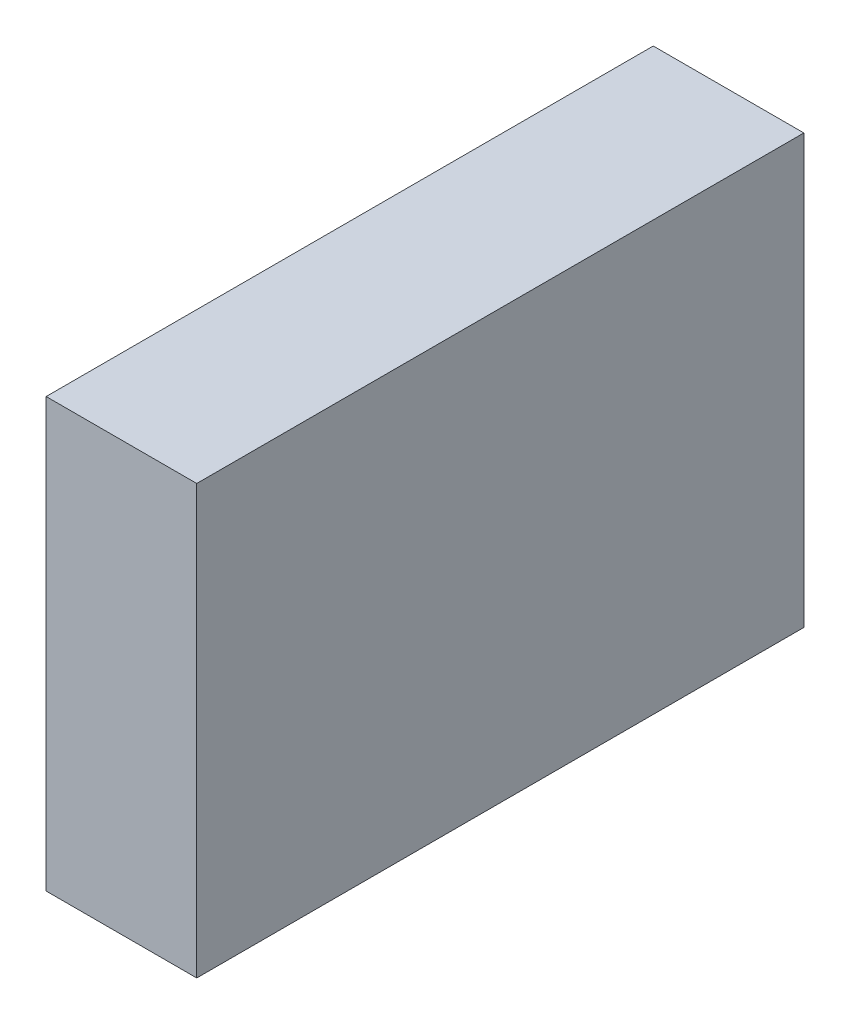
ISO-10303-21;
HEADER;
FILE_DESCRIPTION(('STEP AP214'),'2;1');
FILE_NAME('part.step','',(''),(''),'','','');
FILE_SCHEMA(('AUTOMOTIVE_DESIGN { 1 0 10303 214 1 1 1 1 }'));
ENDSEC;
DATA;
#1=APPLICATION_CONTEXT('core data for automotive mechanical design processes');
#2=APPLICATION_PROTOCOL_DEFINITION('international standard','automotive_design',2000,#1);
#3=PRODUCT_CONTEXT('',#1,'mechanical');
#4=PRODUCT('Part','Part','',(#3));
#5=PRODUCT_RELATED_PRODUCT_CATEGORY('part','',(#4));
#6=PRODUCT_DEFINITION_FORMATION('','',#4);
#7=PRODUCT_DEFINITION_CONTEXT('part definition',#1,'design');
#8=PRODUCT_DEFINITION('design','',#6,#7);
#9=PRODUCT_DEFINITION_SHAPE('','',#8);
#10=(LENGTH_UNIT() NAMED_UNIT(*) SI_UNIT(.MILLI.,.METRE.));
#11=(NAMED_UNIT(*) PLANE_ANGLE_UNIT() SI_UNIT($,.RADIAN.));
#12=(NAMED_UNIT(*) SI_UNIT($,.STERADIAN.) SOLID_ANGLE_UNIT());
#13=UNCERTAINTY_MEASURE_WITH_UNIT(LENGTH_MEASURE(1.E-05),#10,'distance_accuracy_value','');
#14=(GEOMETRIC_REPRESENTATION_CONTEXT(3) GLOBAL_UNCERTAINTY_ASSIGNED_CONTEXT((#13)) GLOBAL_UNIT_ASSIGNED_CONTEXT((#10,
#11,#12)) REPRESENTATION_CONTEXT('',''));
#15=CARTESIAN_POINT('',(0.,0.,0.));
#16=DIRECTION('',(0.,0.,1.));
#17=DIRECTION('',(1.,0.,0.));
#18=AXIS2_PLACEMENT_3D('',#15,#16,#17);
#19=CARTESIAN_POINT('',(-14.,41.5,-60.5));
#20=DIRECTION('',(0.,-1.,0.));
#21=DIRECTION('',(0.,0.,-1.));
#22=AXIS2_PLACEMENT_3D('',#19,#20,#21);
#23=PLANE('',#22);
#24=DIRECTION('',(1.,0.,0.));
#25=VECTOR('',#24,1.);
#26=CARTESIAN_POINT('',(-14.,41.5,-60.5));
#27=LINE('',#26,#25);
#28=CARTESIAN_POINT('',(-14.,41.5,-60.5));
#29=VERTEX_POINT('',#28);
#30=CARTESIAN_POINT('',(-10.16,41.5,-60.5));
#31=VERTEX_POINT('',#30);
#32=EDGE_CURVE('E182',#29,#31,#27,.T.);
#33=ORIENTED_EDGE('',*,*,#32,.T.);
#34=DIRECTION('',(0.,0.,-1.));
#35=VECTOR('',#34,1.);
#36=CARTESIAN_POINT('',(-10.16,41.5,-32.5));
#37=LINE('',#36,#35);
#38=CARTESIAN_POINT('',(-10.16,41.5,-32.5));
#39=VERTEX_POINT('',#38);
#40=EDGE_CURVE('E168',#39,#31,#37,.T.);
#41=ORIENTED_EDGE('',*,*,#40,.F.);
#42=DIRECTION('',(1.,0.,0.));
#43=VECTOR('',#42,1.);
#44=CARTESIAN_POINT('',(-14.,41.5,-32.5));
#45=LINE('',#44,#43);
#46=CARTESIAN_POINT('',(-14.,41.5,-32.5));
#47=VERTEX_POINT('',#46);
#48=EDGE_CURVE('E179',#47,#39,#45,.T.);
#49=ORIENTED_EDGE('',*,*,#48,.F.);
#50=DIRECTION('',(0.,0.,-1.));
#51=VECTOR('',#50,1.);
#52=CARTESIAN_POINT('',(-14.,41.5,-60.5));
#53=LINE('',#52,#51);
#54=EDGE_CURVE('E701',#47,#29,#53,.T.);
#55=ORIENTED_EDGE('',*,*,#54,.T.);
#56=EDGE_LOOP('',(#33,#41,#49,#55));
#57=FACE_BOUND('',#56,.T.);
#58=ADVANCED_FACE('F44',(#57),#23,.T.);
#59=CARTESIAN_POINT('',(-14.,41.5,-60.5));
#60=DIRECTION('',(0.,0.,1.));
#61=DIRECTION('',(1.,0.,0.));
#62=AXIS2_PLACEMENT_3D('',#59,#60,#61);
#63=PLANE('',#62);
#64=DIRECTION('',(1.,0.,0.));
#65=VECTOR('',#64,1.);
#66=CARTESIAN_POINT('',(-14.,0.,-60.5));
#67=LINE('',#66,#65);
#68=CARTESIAN_POINT('',(-14.,0.,-60.5));
#69=VERTEX_POINT('',#68);
#70=CARTESIAN_POINT('',(-10.16,0.,-60.5));
#71=VERTEX_POINT('',#70);
#72=EDGE_CURVE('E194',#69,#71,#67,.T.);
#73=ORIENTED_EDGE('',*,*,#72,.T.);
#74=DIRECTION('',(0.,-1.,0.));
#75=VECTOR('',#74,1.);
#76=CARTESIAN_POINT('',(-10.16,41.5,-60.5));
#77=LINE('',#76,#75);
#78=EDGE_CURVE('E184',#31,#71,#77,.T.);
#79=ORIENTED_EDGE('',*,*,#78,.F.);
#80=ORIENTED_EDGE('',*,*,#32,.F.);
#81=DIRECTION('',(0.,-1.,0.));
#82=VECTOR('',#81,1.);
#83=CARTESIAN_POINT('',(-14.,41.5,-60.5));
#84=LINE('',#83,#82);
#85=EDGE_CURVE('E704',#29,#69,#84,.T.);
#86=ORIENTED_EDGE('',*,*,#85,.T.);
#87=EDGE_LOOP('',(#73,#79,#80,#86));
#88=FACE_BOUND('',#87,.T.);
#89=ADVANCED_FACE('F293',(#88),#63,.T.);
#90=CARTESIAN_POINT('',(-14.,0.,-60.5));
#91=DIRECTION('',(0.,1.,0.));
#92=DIRECTION('',(0.,0.,1.));
#93=AXIS2_PLACEMENT_3D('',#90,#91,#92);
#94=PLANE('',#93);
#95=DIRECTION('',(1.,0.,0.));
#96=VECTOR('',#95,1.);
#97=CARTESIAN_POINT('',(-14.,0.,-32.5));
#98=LINE('',#97,#96);
#99=CARTESIAN_POINT('',(-14.,0.,-32.5));
#100=VERTEX_POINT('',#99);
#101=CARTESIAN_POINT('',(-10.16,0.,-32.5));
#102=VERTEX_POINT('',#101);
#103=EDGE_CURVE('E190',#100,#102,#98,.T.);
#104=ORIENTED_EDGE('',*,*,#103,.T.);
#105=DIRECTION('',(0.,0.,1.));
#106=VECTOR('',#105,1.);
#107=CARTESIAN_POINT('',(-10.16,0.,-32.5));
#108=LINE('',#107,#106);
#109=EDGE_CURVE('E60',#71,#102,#108,.T.);
#110=ORIENTED_EDGE('',*,*,#109,.F.);
#111=ORIENTED_EDGE('',*,*,#72,.F.);
#112=DIRECTION('',(0.,0.,1.));
#113=VECTOR('',#112,1.);
#114=CARTESIAN_POINT('',(-14.,0.,-60.5));
#115=LINE('',#114,#113);
#116=EDGE_CURVE('E196',#69,#100,#115,.T.);
#117=ORIENTED_EDGE('',*,*,#116,.T.);
#118=EDGE_LOOP('',(#104,#110,#111,#117));
#119=FACE_BOUND('',#118,.T.);
#120=ADVANCED_FACE('F299',(#119),#94,.T.);
#121=CARTESIAN_POINT('',(-14.,41.5,-32.5));
#122=DIRECTION('',(0.,0.,-1.));
#123=DIRECTION('',(0.,1.,0.));
#124=AXIS2_PLACEMENT_3D('',#121,#122,#123);
#125=PLANE('',#124);
#126=ORIENTED_EDGE('',*,*,#48,.T.);
#127=DIRECTION('',(0.,1.,0.));
#128=VECTOR('',#127,1.);
#129=CARTESIAN_POINT('',(-10.16,41.5,-32.5));
#130=LINE('',#129,#128);
#131=EDGE_CURVE('E165',#102,#39,#130,.T.);
#132=ORIENTED_EDGE('',*,*,#131,.F.);
#133=ORIENTED_EDGE('',*,*,#103,.F.);
#134=DIRECTION('',(0.,1.,0.));
#135=VECTOR('',#134,1.);
#136=CARTESIAN_POINT('',(-14.,41.5,-32.5));
#137=LINE('',#136,#135);
#138=EDGE_CURVE('E188',#100,#47,#137,.T.);
#139=ORIENTED_EDGE('',*,*,#138,.T.);
#140=EDGE_LOOP('',(#126,#132,#133,#139));
#141=FACE_BOUND('',#140,.T.);
#142=ADVANCED_FACE('F186',(#141),#125,.T.);
#143=CARTESIAN_POINT('',(-14.,0.,0.));
#144=DIRECTION('',(-1.,0.,0.));
#145=DIRECTION('',(0.,0.,1.));
#146=AXIS2_PLACEMENT_3D('',#143,#144,#145);
#147=PLANE('',#146);
#148=ORIENTED_EDGE('',*,*,#85,.F.);
#149=ORIENTED_EDGE('',*,*,#54,.F.);
#150=ORIENTED_EDGE('',*,*,#138,.F.);
#151=ORIENTED_EDGE('',*,*,#116,.F.);
#152=EDGE_LOOP('',(#148,#149,#150,#151));
#153=FACE_BOUND('',#152,.T.);
#154=DIRECTION('',(0.,0.,1.));
#155=VECTOR('',#154,1.);
#156=CARTESIAN_POINT('',(-14.,-2.,-62.5));
#157=LINE('',#156,#155);
#158=CARTESIAN_POINT('',(-14.,-2.,-62.5));
#159=VERTEX_POINT('',#158);
#160=CARTESIAN_POINT('',(-14.,-2.,-28.));
#161=VERTEX_POINT('',#160);
#162=EDGE_CURVE('E210',#159,#161,#157,.T.);
#163=ORIENTED_EDGE('',*,*,#162,.T.);
#164=DIRECTION('',(0.,-1.,0.));
#165=VECTOR('',#164,1.);
#166=CARTESIAN_POINT('',(-14.,43.501,-28.));
#167=LINE('',#166,#165);
#168=CARTESIAN_POINT('',(-14.,0.,-28.));
#169=VERTEX_POINT('',#168);
#170=EDGE_CURVE('E651',#169,#161,#167,.T.);
#171=ORIENTED_EDGE('',*,*,#170,.F.);
#172=DIRECTION('',(0.,-1.,0.));
#173=VECTOR('',#172,1.);
#174=CARTESIAN_POINT('',(-14.,41.5,-28.));
#175=LINE('',#174,#173);
#176=CARTESIAN_POINT('',(-14.,41.5,-28.));
#177=VERTEX_POINT('',#176);
#178=EDGE_CURVE('E669',#177,#169,#175,.T.);
#179=ORIENTED_EDGE('',*,*,#178,.F.);
#180=DIRECTION('',(0.,0.,-1.));
#181=VECTOR('',#180,1.);
#182=CARTESIAN_POINT('',(-14.,41.5,-28.));
#183=LINE('',#182,#181);
#184=CARTESIAN_POINT('',(-14.,41.5,0.));
#185=VERTEX_POINT('',#184);
#186=EDGE_CURVE('E664',#185,#177,#183,.T.);
#187=ORIENTED_EDGE('',*,*,#186,.F.);
#188=DIRECTION('',(0.,1.,0.));
#189=VECTOR('',#188,1.);
#190=CARTESIAN_POINT('',(-14.,41.5,0.));
#191=LINE('',#190,#189);
#192=CARTESIAN_POINT('',(-14.,0.,0.));
#193=VERTEX_POINT('',#192);
#194=EDGE_CURVE('E661',#193,#185,#191,.T.);
#195=ORIENTED_EDGE('',*,*,#194,.F.);
#196=DIRECTION('',(0.,-1.,0.));
#197=VECTOR('',#196,1.);
#198=CARTESIAN_POINT('',(-14.,43.501,0.));
#199=LINE('',#198,#197);
#200=CARTESIAN_POINT('',(-14.,-2.,0.));
#201=VERTEX_POINT('',#200);
#202=EDGE_CURVE('E648',#201,#193,#199,.F.);
#203=ORIENTED_EDGE('',*,*,#202,.F.);
#204=CARTESIAN_POINT('',(-14.,-2.,2.));
#205=VERTEX_POINT('',#204);
#206=EDGE_CURVE('E209',#201,#205,#157,.T.);
#207=ORIENTED_EDGE('',*,*,#206,.T.);
#208=DIRECTION('',(0.,1.,0.));
#209=VECTOR('',#208,1.);
#210=CARTESIAN_POINT('',(-14.,43.5,2.));
#211=LINE('',#210,#209);
#212=CARTESIAN_POINT('',(-14.,43.5,2.));
#213=VERTEX_POINT('',#212);
#214=EDGE_CURVE('E214',#205,#213,#211,.T.);
#215=ORIENTED_EDGE('',*,*,#214,.T.);
#216=DIRECTION('',(0.,0.,-1.));
#217=VECTOR('',#216,1.);
#218=CARTESIAN_POINT('',(-14.,43.5,-62.5));
#219=LINE('',#218,#217);
#220=CARTESIAN_POINT('',(-14.,43.5,-62.5));
#221=VERTEX_POINT('',#220);
#222=EDGE_CURVE('E218',#213,#221,#219,.T.);
#223=ORIENTED_EDGE('',*,*,#222,.T.);
#224=DIRECTION('',(0.,-1.,0.));
#225=VECTOR('',#224,1.);
#226=CARTESIAN_POINT('',(-14.,43.5,-62.5));
#227=LINE('',#226,#225);
#228=EDGE_CURVE('E205',#221,#159,#227,.T.);
#229=ORIENTED_EDGE('',*,*,#228,.T.);
#230=EDGE_LOOP('',(#163,#171,#179,#187,#195,#203,#207,#215,#223,#229));
#231=FACE_BOUND('',#230,.T.);
#232=DIRECTION('',(0.,-1.,0.));
#233=VECTOR('',#232,1.);
#234=CARTESIAN_POINT('',(-14.,40.5,-31.5));
#235=LINE('',#234,#233);
#236=CARTESIAN_POINT('',(-14.,40.5,-31.5));
#237=VERTEX_POINT('',#236);
#238=CARTESIAN_POINT('',(-14.,1.,-31.5));
#239=VERTEX_POINT('',#238);
#240=EDGE_CURVE('E612',#237,#239,#235,.T.);
#241=ORIENTED_EDGE('',*,*,#240,.F.);
#242=DIRECTION('',(0.,0.,1.));
#243=VECTOR('',#242,1.);
#244=CARTESIAN_POINT('',(-14.,40.5,-31.5));
#245=LINE('',#244,#243);
#246=CARTESIAN_POINT('',(-14.,40.5,-29.));
#247=VERTEX_POINT('',#246);
#248=EDGE_CURVE('E68',#237,#247,#245,.T.);
#249=ORIENTED_EDGE('',*,*,#248,.T.);
#250=DIRECTION('',(0.,-1.,0.));
#251=VECTOR('',#250,1.);
#252=CARTESIAN_POINT('',(-14.,40.5,-29.));
#253=LINE('',#252,#251);
#254=CARTESIAN_POINT('',(-14.,1.,-29.));
#255=VERTEX_POINT('',#254);
#256=EDGE_CURVE('E626',#247,#255,#253,.T.);
#257=ORIENTED_EDGE('',*,*,#256,.T.);
#258=DIRECTION('',(0.,0.,1.));
#259=VECTOR('',#258,1.);
#260=CARTESIAN_POINT('',(-14.,1.,-31.5));
#261=LINE('',#260,#259);
#262=EDGE_CURVE('E630',#239,#255,#261,.T.);
#263=ORIENTED_EDGE('',*,*,#262,.F.);
#264=EDGE_LOOP('',(#241,#249,#257,#263));
#265=FACE_BOUND('',#264,.T.);
#266=ADVANCED_FACE('F271',(#153,#231,#265),#147,.T.);
#267=CARTESIAN_POINT('',(-14.,0.,-28.));
#268=DIRECTION('',(0.,1.,0.));
#269=DIRECTION('',(0.,0.,1.));
#270=AXIS2_PLACEMENT_3D('',#267,#268,#269);
#271=PLANE('',#270);
#272=DIRECTION('',(1.,0.,0.));
#273=VECTOR('',#272,1.);
#274=CARTESIAN_POINT('',(-14.,0.,-28.));
#275=LINE('',#274,#273);
#276=CARTESIAN_POINT('',(0.,0.,-28.));
#277=VERTEX_POINT('',#276);
#278=EDGE_CURVE('E673',#169,#277,#275,.T.);
#279=ORIENTED_EDGE('',*,*,#278,.F.);
#280=CARTESIAN_POINT('',(-14.,0.,-14.));
#281=DIRECTION('',(0.,1.,0.));
#282=DIRECTION('',(0.,0.,1.));
#283=AXIS2_PLACEMENT_3D('',#280,#281,#282);
#284=CIRCLE('',#283,14.);
#285=CARTESIAN_POINT('',(0.,0.,-14.));
#286=VERTEX_POINT('',#285);
#287=EDGE_CURVE('E656',#286,#169,#284,.T.);
#288=ORIENTED_EDGE('',*,*,#287,.F.);
#289=DIRECTION('',(0.,0.,1.));
#290=VECTOR('',#289,1.);
#291=CARTESIAN_POINT('',(0.,0.,-28.));
#292=LINE('',#291,#290);
#293=EDGE_CURVE('E674',#277,#286,#292,.T.);
#294=ORIENTED_EDGE('',*,*,#293,.F.);
#295=EDGE_LOOP('',(#279,#288,#294));
#296=FACE_BOUND('',#295,.T.);
#297=ADVANCED_FACE('F284',(#296),#271,.T.);
#298=CARTESIAN_POINT('',(2.,-2.,2.));
#299=DIRECTION('',(0.,0.,-1.));
#300=DIRECTION('',(-1.,0.,0.));
#301=AXIS2_PLACEMENT_3D('',#298,#299,#300);
#302=PLANE('',#301);
#303=DIRECTION('',(-1.,0.,0.));
#304=VECTOR('',#303,1.);
#305=CARTESIAN_POINT('',(2.,43.5,2.));
#306=LINE('',#305,#304);
#307=CARTESIAN_POINT('',(2.,43.5,2.));
#308=VERTEX_POINT('',#307);
#309=EDGE_CURVE('E235',#308,#213,#306,.T.);
#310=ORIENTED_EDGE('',*,*,#309,.T.);
#311=ORIENTED_EDGE('',*,*,#214,.F.);
#312=DIRECTION('',(-1.,0.,0.));
#313=VECTOR('',#312,1.);
#314=CARTESIAN_POINT('',(2.,-2.,2.));
#315=LINE('',#314,#313);
#316=CARTESIAN_POINT('',(2.,-2.,2.));
#317=VERTEX_POINT('',#316);
#318=EDGE_CURVE('E244',#317,#205,#315,.T.);
#319=ORIENTED_EDGE('',*,*,#318,.F.);
#320=DIRECTION('',(0.,-1.,0.));
#321=VECTOR('',#320,1.);
#322=CARTESIAN_POINT('',(2.,-2.,2.));
#323=LINE('',#322,#321);
#324=EDGE_CURVE('E222',#308,#317,#323,.T.);
#325=ORIENTED_EDGE('',*,*,#324,.F.);
#326=EDGE_LOOP('',(#310,#311,#319,#325));
#327=FACE_BOUND('',#326,.T.);
#328=ADVANCED_FACE('F46',(#327),#302,.F.);
#329=CARTESIAN_POINT('',(2.,-2.,2.));
#330=DIRECTION('',(0.,1.,0.));
#331=DIRECTION('',(0.,0.,1.));
#332=AXIS2_PLACEMENT_3D('',#329,#330,#331);
#333=PLANE('',#332);
#334=CARTESIAN_POINT('',(-14.,-2.,-14.));
#335=DIRECTION('',(0.,1.,0.));
#336=DIRECTION('',(0.,0.,1.));
#337=AXIS2_PLACEMENT_3D('',#334,#335,#336);
#338=CIRCLE('',#337,14.);
#339=EDGE_CURVE('E268',#201,#161,#338,.T.);
#340=ORIENTED_EDGE('',*,*,#339,.T.);
#341=ORIENTED_EDGE('',*,*,#162,.F.);
#342=DIRECTION('',(-1.,0.,0.));
#343=VECTOR('',#342,1.);
#344=CARTESIAN_POINT('',(2.,-2.,-62.5));
#345=LINE('',#344,#343);
#346=CARTESIAN_POINT('',(2.,-2.,-62.5));
#347=VERTEX_POINT('',#346);
#348=EDGE_CURVE('E241',#347,#159,#345,.T.);
#349=ORIENTED_EDGE('',*,*,#348,.F.);
#350=DIRECTION('',(0.,0.,-1.));
#351=VECTOR('',#350,1.);
#352=CARTESIAN_POINT('',(2.,-2.,2.));
#353=LINE('',#352,#351);
#354=EDGE_CURVE('E226',#317,#347,#353,.T.);
#355=ORIENTED_EDGE('',*,*,#354,.F.);
#356=ORIENTED_EDGE('',*,*,#318,.T.);
#357=ORIENTED_EDGE('',*,*,#206,.F.);
#358=EDGE_LOOP('',(#340,#341,#349,#355,#356,#357));
#359=FACE_BOUND('',#358,.T.);
#360=ADVANCED_FACE('F257',(#359),#333,.F.);
#361=CARTESIAN_POINT('',(2.,-2.,-62.5));
#362=DIRECTION('',(0.,0.,1.));
#363=DIRECTION('',(1.,0.,0.));
#364=AXIS2_PLACEMENT_3D('',#361,#362,#363);
#365=PLANE('',#364);
#366=CARTESIAN_POINT('',(-11.968,19.68025612,-62.5));
#367=DIRECTION('',(0.,0.,1.));
#368=DIRECTION('',(1.,0.,0.));
#369=AXIS2_PLACEMENT_3D('',#366,#367,#368);
#370=CIRCLE('',#369,1.2);
#371=CARTESIAN_POINT('',(-10.768,19.68025612,-62.5));
#372=VERTEX_POINT('',#371);
#373=EDGE_CURVE('E12',#372,#372,#370,.F.);
#374=ORIENTED_EDGE('',*,*,#373,.F.);
#375=EDGE_LOOP('',(#374));
#376=FACE_BOUND('',#375,.T.);
#377=CARTESIAN_POINT('',(-11.968,10.7,-62.5));
#378=DIRECTION('',(0.,0.,1.));
#379=DIRECTION('',(1.,0.,0.));
#380=AXIS2_PLACEMENT_3D('',#377,#378,#379);
#381=CIRCLE('',#380,1.2);
#382=CARTESIAN_POINT('',(-10.768,10.7,-62.5));
#383=VERTEX_POINT('',#382);
#384=EDGE_CURVE('E53',#383,#383,#381,.F.);
#385=ORIENTED_EDGE('',*,*,#384,.F.);
#386=EDGE_LOOP('',(#385));
#387=FACE_BOUND('',#386,.T.);
#388=ORIENTED_EDGE('',*,*,#348,.T.);
#389=ORIENTED_EDGE('',*,*,#228,.F.);
#390=DIRECTION('',(-1.,0.,0.));
#391=VECTOR('',#390,1.);
#392=CARTESIAN_POINT('',(2.,43.5,-62.5));
#393=LINE('',#392,#391);
#394=CARTESIAN_POINT('',(2.,43.5,-62.5));
#395=VERTEX_POINT('',#394);
#396=EDGE_CURVE('E238',#395,#221,#393,.T.);
#397=ORIENTED_EDGE('',*,*,#396,.F.);
#398=DIRECTION('',(0.,1.,0.));
#399=VECTOR('',#398,1.);
#400=CARTESIAN_POINT('',(2.,-2.,-62.5));
#401=LINE('',#400,#399);
#402=EDGE_CURVE('E229',#347,#395,#401,.T.);
#403=ORIENTED_EDGE('',*,*,#402,.F.);
#404=EDGE_LOOP('',(#388,#389,#397,#403));
#405=FACE_BOUND('',#404,.T.);
#406=ADVANCED_FACE('F253',(#376,#387,#405),#365,.F.);
#407=CARTESIAN_POINT('',(2.,43.5,2.));
#408=DIRECTION('',(0.,-1.,0.));
#409=DIRECTION('',(0.,0.,-1.));
#410=AXIS2_PLACEMENT_3D('',#407,#408,#409);
#411=PLANE('',#410);
#412=ORIENTED_EDGE('',*,*,#396,.T.);
#413=ORIENTED_EDGE('',*,*,#222,.F.);
#414=ORIENTED_EDGE('',*,*,#309,.F.);
#415=DIRECTION('',(0.,0.,1.));
#416=VECTOR('',#415,1.);
#417=CARTESIAN_POINT('',(2.,43.5,2.));
#418=LINE('',#417,#416);
#419=EDGE_CURVE('E232',#395,#308,#418,.T.);
#420=ORIENTED_EDGE('',*,*,#419,.F.);
#421=EDGE_LOOP('',(#412,#413,#414,#420));
#422=FACE_BOUND('',#421,.T.);
#423=ADVANCED_FACE('F256',(#422),#411,.F.);
#424=CARTESIAN_POINT('',(2.,0.,0.));
#425=DIRECTION('',(-1.,0.,0.));
#426=DIRECTION('',(0.,0.,1.));
#427=AXIS2_PLACEMENT_3D('',#424,#425,#426);
#428=PLANE('',#427);
#429=ORIENTED_EDGE('',*,*,#324,.T.);
#430=ORIENTED_EDGE('',*,*,#354,.T.);
#431=ORIENTED_EDGE('',*,*,#402,.T.);
#432=ORIENTED_EDGE('',*,*,#419,.T.);
#433=EDGE_LOOP('',(#429,#430,#431,#432));
#434=FACE_BOUND('',#433,.T.);
#435=ADVANCED_FACE('F280',(#434),#428,.F.);
#436=CARTESIAN_POINT('',(0.,0.,0.));
#437=VERTEX_POINT('',#436);
#438=EDGE_CURVE('E660',#286,#437,#292,.T.);
#439=ORIENTED_EDGE('',*,*,#438,.F.);
#440=EDGE_CURVE('E657',#193,#286,#284,.T.);
#441=ORIENTED_EDGE('',*,*,#440,.F.);
#442=DIRECTION('',(1.,0.,0.));
#443=VECTOR('',#442,1.);
#444=CARTESIAN_POINT('',(-14.,0.,0.));
#445=LINE('',#444,#443);
#446=EDGE_CURVE('E697',#193,#437,#445,.T.);
#447=ORIENTED_EDGE('',*,*,#446,.T.);
#448=EDGE_LOOP('',(#439,#441,#447));
#449=FACE_BOUND('',#448,.T.);
#450=ADVANCED_FACE('F291',(#449),#271,.T.);
#451=CARTESIAN_POINT('',(-14.,41.5,0.));
#452=DIRECTION('',(0.,0.,-1.));
#453=DIRECTION('',(-1.,0.,0.));
#454=AXIS2_PLACEMENT_3D('',#451,#452,#453);
#455=PLANE('',#454);
#456=DIRECTION('',(0.,1.,0.));
#457=VECTOR('',#456,1.);
#458=CARTESIAN_POINT('',(0.,41.5,0.));
#459=LINE('',#458,#457);
#460=CARTESIAN_POINT('',(0.,41.5,0.));
#461=VERTEX_POINT('',#460);
#462=EDGE_CURVE('E678',#437,#461,#459,.T.);
#463=ORIENTED_EDGE('',*,*,#462,.F.);
#464=ORIENTED_EDGE('',*,*,#446,.F.);
#465=ORIENTED_EDGE('',*,*,#194,.T.);
#466=DIRECTION('',(1.,0.,0.));
#467=VECTOR('',#466,1.);
#468=CARTESIAN_POINT('',(-14.,41.5,0.));
#469=LINE('',#468,#467);
#470=EDGE_CURVE('E693',#185,#461,#469,.T.);
#471=ORIENTED_EDGE('',*,*,#470,.T.);
#472=EDGE_LOOP('',(#463,#464,#465,#471));
#473=FACE_BOUND('',#472,.T.);
#474=ADVANCED_FACE('F332',(#473),#455,.T.);
#475=CARTESIAN_POINT('',(-14.,41.5,-28.));
#476=DIRECTION('',(0.,-1.,0.));
#477=DIRECTION('',(0.,0.,-1.));
#478=AXIS2_PLACEMENT_3D('',#475,#476,#477);
#479=PLANE('',#478);
#480=DIRECTION('',(0.,0.,-1.));
#481=VECTOR('',#480,1.);
#482=CARTESIAN_POINT('',(0.,41.5,-28.));
#483=LINE('',#482,#481);
#484=CARTESIAN_POINT('',(0.,41.5,-28.));
#485=VERTEX_POINT('',#484);
#486=EDGE_CURVE('E681',#461,#485,#483,.T.);
#487=ORIENTED_EDGE('',*,*,#486,.F.);
#488=ORIENTED_EDGE('',*,*,#470,.F.);
#489=ORIENTED_EDGE('',*,*,#186,.T.);
#490=DIRECTION('',(1.,0.,0.));
#491=VECTOR('',#490,1.);
#492=CARTESIAN_POINT('',(-14.,41.5,-28.));
#493=LINE('',#492,#491);
#494=EDGE_CURVE('E689',#177,#485,#493,.T.);
#495=ORIENTED_EDGE('',*,*,#494,.T.);
#496=EDGE_LOOP('',(#487,#488,#489,#495));
#497=FACE_BOUND('',#496,.T.);
#498=ADVANCED_FACE('F340',(#497),#479,.T.);
#499=CARTESIAN_POINT('',(-14.,41.5,-28.));
#500=DIRECTION('',(0.,0.,1.));
#501=DIRECTION('',(0.,-1.,0.));
#502=AXIS2_PLACEMENT_3D('',#499,#500,#501);
#503=PLANE('',#502);
#504=DIRECTION('',(0.,-1.,0.));
#505=VECTOR('',#504,1.);
#506=CARTESIAN_POINT('',(0.,41.5,-28.));
#507=LINE('',#506,#505);
#508=EDGE_CURVE('E665',#485,#277,#507,.T.);
#509=ORIENTED_EDGE('',*,*,#508,.F.);
#510=ORIENTED_EDGE('',*,*,#494,.F.);
#511=ORIENTED_EDGE('',*,*,#178,.T.);
#512=ORIENTED_EDGE('',*,*,#278,.T.);
#513=EDGE_LOOP('',(#509,#510,#511,#512));
#514=FACE_BOUND('',#513,.T.);
#515=ADVANCED_FACE('F313',(#514),#503,.T.);
#516=CARTESIAN_POINT('',(0.,0.,0.));
#517=DIRECTION('',(-1.,0.,0.));
#518=DIRECTION('',(0.,0.,1.));
#519=AXIS2_PLACEMENT_3D('',#516,#517,#518);
#520=PLANE('',#519);
#521=ORIENTED_EDGE('',*,*,#293,.T.);
#522=ORIENTED_EDGE('',*,*,#438,.T.);
#523=ORIENTED_EDGE('',*,*,#462,.T.);
#524=ORIENTED_EDGE('',*,*,#486,.T.);
#525=ORIENTED_EDGE('',*,*,#508,.T.);
#526=EDGE_LOOP('',(#521,#522,#523,#524,#525));
#527=FACE_BOUND('',#526,.T.);
#528=ADVANCED_FACE('F309',(#527),#520,.T.);
#529=CARTESIAN_POINT('',(-14.,43.501,-14.));
#530=DIRECTION('',(0.,-1.,0.));
#531=DIRECTION('',(0.,0.,-1.));
#532=AXIS2_PLACEMENT_3D('',#529,#530,#531);
#533=CYLINDRICAL_SURFACE('',#532,14.);
#534=ORIENTED_EDGE('',*,*,#202,.T.);
#535=ORIENTED_EDGE('',*,*,#440,.T.);
#536=ORIENTED_EDGE('',*,*,#287,.T.);
#537=ORIENTED_EDGE('',*,*,#170,.T.);
#538=ORIENTED_EDGE('',*,*,#339,.F.);
#539=EDGE_LOOP('',(#534,#535,#536,#537,#538));
#540=FACE_BOUND('',#539,.T.);
#541=ADVANCED_FACE('F312',(#540),#533,.F.);
#542=CARTESIAN_POINT('',(-8.5,40.5,-31.5));
#543=DIRECTION('',(0.,-1.,0.));
#544=DIRECTION('',(0.,0.,-1.));
#545=AXIS2_PLACEMENT_3D('',#542,#543,#544);
#546=PLANE('',#545);
#547=ORIENTED_EDGE('',*,*,#248,.F.);
#548=DIRECTION('',(-1.,0.,0.));
#549=VECTOR('',#548,1.);
#550=CARTESIAN_POINT('',(-8.5,40.5,-31.5));
#551=LINE('',#550,#549);
#552=CARTESIAN_POINT('',(-8.5,40.5,-31.5));
#553=VERTEX_POINT('',#552);
#554=EDGE_CURVE('E623',#553,#237,#551,.T.);
#555=ORIENTED_EDGE('',*,*,#554,.F.);
#556=DIRECTION('',(0.,0.,1.));
#557=VECTOR('',#556,1.);
#558=CARTESIAN_POINT('',(-8.5,40.5,-31.5));
#559=LINE('',#558,#557);
#560=CARTESIAN_POINT('',(-8.5,40.5,-29.));
#561=VERTEX_POINT('',#560);
#562=EDGE_CURVE('E607',#553,#561,#559,.T.);
#563=ORIENTED_EDGE('',*,*,#562,.T.);
#564=DIRECTION('',(-1.,0.,0.));
#565=VECTOR('',#564,1.);
#566=CARTESIAN_POINT('',(-8.5,40.5,-29.));
#567=LINE('',#566,#565);
#568=EDGE_CURVE('E645',#561,#247,#567,.T.);
#569=ORIENTED_EDGE('',*,*,#568,.T.);
#570=EDGE_LOOP('',(#547,#555,#563,#569));
#571=FACE_BOUND('',#570,.T.);
#572=ADVANCED_FACE('F366',(#571),#546,.T.);
#573=CARTESIAN_POINT('',(-8.5,40.5,-29.));
#574=DIRECTION('',(0.,0.,-1.));
#575=DIRECTION('',(-1.,0.,0.));
#576=AXIS2_PLACEMENT_3D('',#573,#574,#575);
#577=PLANE('',#576);
#578=ORIENTED_EDGE('',*,*,#256,.F.);
#579=ORIENTED_EDGE('',*,*,#568,.F.);
#580=DIRECTION('',(0.,-1.,0.));
#581=VECTOR('',#580,1.);
#582=CARTESIAN_POINT('',(-8.5,40.5,-29.));
#583=LINE('',#582,#581);
#584=CARTESIAN_POINT('',(-8.5,1.,-29.));
#585=VERTEX_POINT('',#584);
#586=EDGE_CURVE('E611',#561,#585,#583,.T.);
#587=ORIENTED_EDGE('',*,*,#586,.T.);
#588=DIRECTION('',(-1.,0.,0.));
#589=VECTOR('',#588,1.);
#590=CARTESIAN_POINT('',(-8.5,1.,-29.));
#591=LINE('',#590,#589);
#592=EDGE_CURVE('E642',#585,#255,#591,.T.);
#593=ORIENTED_EDGE('',*,*,#592,.T.);
#594=EDGE_LOOP('',(#578,#579,#587,#593));
#595=FACE_BOUND('',#594,.T.);
#596=ADVANCED_FACE('F375',(#595),#577,.T.);
#597=CARTESIAN_POINT('',(-8.5,1.,-31.5));
#598=DIRECTION('',(0.,-1.,0.));
#599=DIRECTION('',(0.,0.,-1.));
#600=AXIS2_PLACEMENT_3D('',#597,#598,#599);
#601=PLANE('',#600);
#602=ORIENTED_EDGE('',*,*,#262,.T.);
#603=ORIENTED_EDGE('',*,*,#592,.F.);
#604=DIRECTION('',(0.,0.,1.));
#605=VECTOR('',#604,1.);
#606=CARTESIAN_POINT('',(-8.5,1.,-31.5));
#607=LINE('',#606,#605);
#608=CARTESIAN_POINT('',(-8.5,1.,-31.5));
#609=VERTEX_POINT('',#608);
#610=EDGE_CURVE('E615',#609,#585,#607,.T.);
#611=ORIENTED_EDGE('',*,*,#610,.F.);
#612=DIRECTION('',(-1.,0.,0.));
#613=VECTOR('',#612,1.);
#614=CARTESIAN_POINT('',(-8.5,1.,-31.5));
#615=LINE('',#614,#613);
#616=EDGE_CURVE('E639',#609,#239,#615,.T.);
#617=ORIENTED_EDGE('',*,*,#616,.T.);
#618=EDGE_LOOP('',(#602,#603,#611,#617));
#619=FACE_BOUND('',#618,.T.);
#620=ADVANCED_FACE('F382',(#619),#601,.F.);
#621=CARTESIAN_POINT('',(-8.5,40.5,-31.5));
#622=DIRECTION('',(0.,0.,-1.));
#623=DIRECTION('',(-1.,0.,0.));
#624=AXIS2_PLACEMENT_3D('',#621,#622,#623);
#625=PLANE('',#624);
#626=ORIENTED_EDGE('',*,*,#240,.T.);
#627=ORIENTED_EDGE('',*,*,#616,.F.);
#628=DIRECTION('',(0.,-1.,0.));
#629=VECTOR('',#628,1.);
#630=CARTESIAN_POINT('',(-8.5,40.5,-31.5));
#631=LINE('',#630,#629);
#632=EDGE_CURVE('E619',#553,#609,#631,.T.);
#633=ORIENTED_EDGE('',*,*,#632,.F.);
#634=ORIENTED_EDGE('',*,*,#554,.T.);
#635=EDGE_LOOP('',(#626,#627,#633,#634));
#636=FACE_BOUND('',#635,.T.);
#637=ADVANCED_FACE('F390',(#636),#625,.F.);
#638=CARTESIAN_POINT('',(-8.5,0.,0.));
#639=DIRECTION('',(1.,0.,0.));
#640=DIRECTION('',(0.,0.,-1.));
#641=AXIS2_PLACEMENT_3D('',#638,#639,#640);
#642=PLANE('',#641);
#643=ORIENTED_EDGE('',*,*,#562,.F.);
#644=ORIENTED_EDGE('',*,*,#632,.T.);
#645=ORIENTED_EDGE('',*,*,#610,.T.);
#646=ORIENTED_EDGE('',*,*,#586,.F.);
#647=EDGE_LOOP('',(#643,#644,#645,#646));
#648=FACE_BOUND('',#647,.T.);
#649=ADVANCED_FACE('F398',(#648),#642,.F.);
#650=CARTESIAN_POINT('',(-10.16,0.,0.));
#651=DIRECTION('',(1.,0.,0.));
#652=DIRECTION('',(0.,0.,-1.));
#653=AXIS2_PLACEMENT_3D('',#650,#651,#652);
#654=PLANE('',#653);
#655=ORIENTED_EDGE('',*,*,#131,.T.);
#656=ORIENTED_EDGE('',*,*,#40,.T.);
#657=ORIENTED_EDGE('',*,*,#78,.T.);
#658=ORIENTED_EDGE('',*,*,#109,.T.);
#659=EDGE_LOOP('',(#655,#656,#657,#658));
#660=FACE_BOUND('',#659,.T.);
#661=ADVANCED_FACE('F167',(#660),#654,.F.);
#662=CARTESIAN_POINT('',(-11.968,10.7,-67.58));
#663=DIRECTION('',(0.,0.,1.));
#664=DIRECTION('',(1.,0.,0.));
#665=AXIS2_PLACEMENT_3D('',#662,#663,#664);
#666=CYLINDRICAL_SURFACE('',#665,1.2);
#667=CARTESIAN_POINT('',(-11.968,10.7,-67.58));
#668=DIRECTION('',(0.,0.,-1.));
#669=DIRECTION('',(-1.,0.,0.));
#670=AXIS2_PLACEMENT_3D('',#667,#668,#669);
#671=CIRCLE('',#670,1.2);
#672=CARTESIAN_POINT('',(-13.168,10.7,-67.58));
#673=VERTEX_POINT('',#672);
#674=EDGE_CURVE('E174',#673,#673,#671,.T.);
#675=ORIENTED_EDGE('',*,*,#674,.F.);
#676=EDGE_LOOP('',(#675));
#677=FACE_BOUND('',#676,.T.);
#678=ORIENTED_EDGE('',*,*,#384,.T.);
#679=EDGE_LOOP('',(#678));
#680=FACE_BOUND('',#679,.T.);
#681=ADVANCED_FACE('F251',(#677,#680),#666,.T.);
#682=CARTESIAN_POINT('',(-11.968,10.7,-67.58));
#683=DIRECTION('',(0.,0.,-1.));
#684=DIRECTION('',(-1.,0.,0.));
#685=AXIS2_PLACEMENT_3D('',#682,#683,#684);
#686=PLANE('',#685);
#687=ORIENTED_EDGE('',*,*,#674,.T.);
#688=EDGE_LOOP('',(#687));
#689=FACE_BOUND('',#688,.T.);
#690=ADVANCED_FACE('F445',(#689),#686,.T.);
#691=CARTESIAN_POINT('',(-11.968,19.68025612,-67.58));
#692=DIRECTION('',(0.,0.,1.));
#693=DIRECTION('',(1.,0.,0.));
#694=AXIS2_PLACEMENT_3D('',#691,#692,#693);
#695=CYLINDRICAL_SURFACE('',#694,1.2);
#696=CARTESIAN_POINT('',(-11.968,19.68025612,-67.58));
#697=DIRECTION('',(0.,0.,-1.));
#698=DIRECTION('',(-1.,0.,0.));
#699=AXIS2_PLACEMENT_3D('',#696,#697,#698);
#700=CIRCLE('',#699,1.2);
#701=CARTESIAN_POINT('',(-13.168,19.68025612,-67.58));
#702=VERTEX_POINT('',#701);
#703=EDGE_CURVE('E596',#702,#702,#700,.T.);
#704=ORIENTED_EDGE('',*,*,#703,.F.);
#705=EDGE_LOOP('',(#704));
#706=FACE_BOUND('',#705,.T.);
#707=ORIENTED_EDGE('',*,*,#373,.T.);
#708=EDGE_LOOP('',(#707));
#709=FACE_BOUND('',#708,.T.);
#710=ADVANCED_FACE('F453',(#706,#709),#695,.T.);
#711=CARTESIAN_POINT('',(-11.968,19.68025612,-67.58));
#712=DIRECTION('',(0.,0.,-1.));
#713=DIRECTION('',(-1.,0.,0.));
#714=AXIS2_PLACEMENT_3D('',#711,#712,#713);
#715=PLANE('',#714);
#716=ORIENTED_EDGE('',*,*,#703,.T.);
#717=EDGE_LOOP('',(#716));
#718=FACE_BOUND('',#717,.T.);
#719=ADVANCED_FACE('F461',(#718),#715,.T.);
#720=CLOSED_SHELL('',(#58,#89,#120,#142,#266,#297,#328,#360,#406,#423,#435,#450,#474,#498,#515,
#528,#541,#572,#596,#620,#637,#649,#661,#681,#690,#710,#719));
#721=MANIFOLD_SOLID_BREP('B2',#720);
#722=ADVANCED_BREP_SHAPE_REPRESENTATION('',(#18,#721),#14);
#723=SHAPE_DEFINITION_REPRESENTATION(#9,#722);
ENDSEC;
END-ISO-10303-21;
